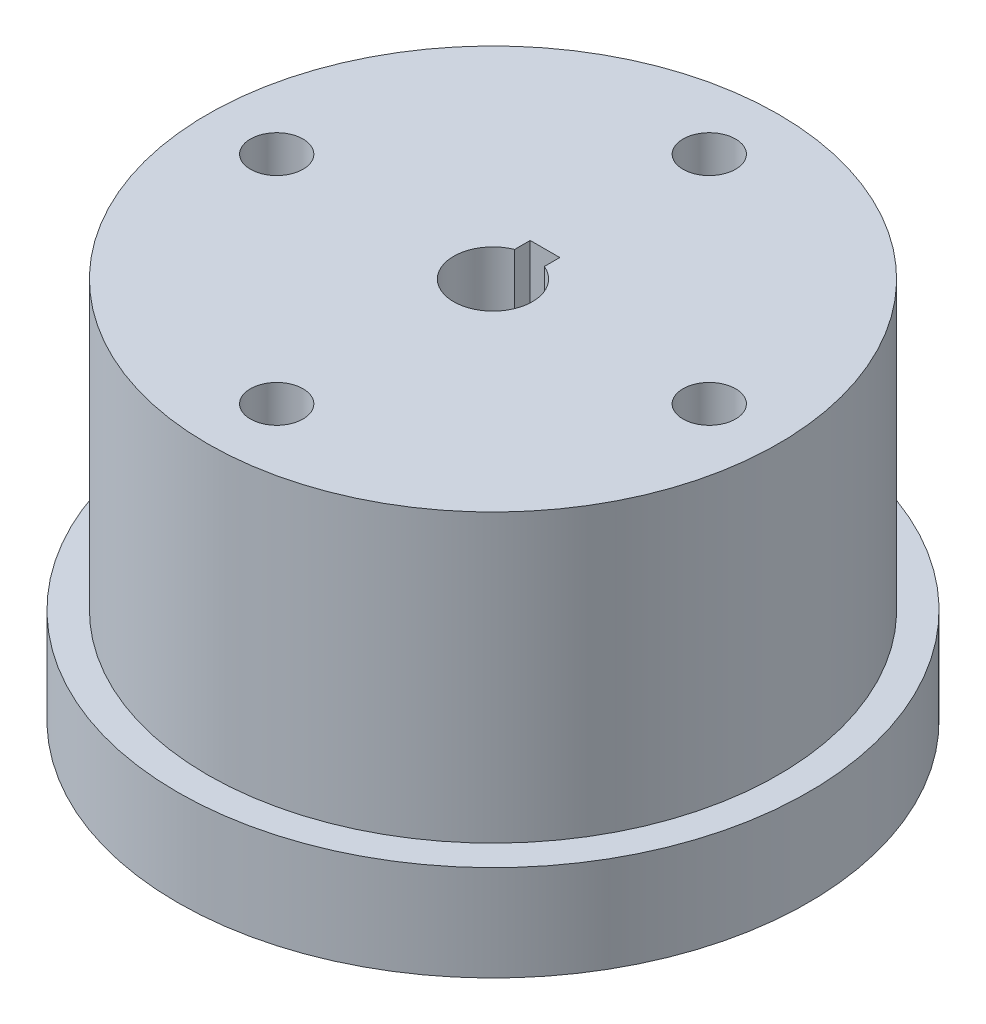
ISO-10303-21;
HEADER;
FILE_DESCRIPTION(('STEP AP214'),'2;1');
FILE_NAME('part.step','',(''),(''),'','','');
FILE_SCHEMA(('AUTOMOTIVE_DESIGN { 1 0 10303 214 1 1 1 1 }'));
ENDSEC;
DATA;
#1=APPLICATION_CONTEXT('core data for automotive mechanical design processes');
#2=APPLICATION_PROTOCOL_DEFINITION('international standard','automotive_design',2000,#1);
#3=PRODUCT_CONTEXT('',#1,'mechanical');
#4=PRODUCT('Part','Part','',(#3));
#5=PRODUCT_RELATED_PRODUCT_CATEGORY('part','',(#4));
#6=PRODUCT_DEFINITION_FORMATION('','',#4);
#7=PRODUCT_DEFINITION_CONTEXT('part definition',#1,'design');
#8=PRODUCT_DEFINITION('design','',#6,#7);
#9=PRODUCT_DEFINITION_SHAPE('','',#8);
#10=(LENGTH_UNIT() NAMED_UNIT(*) SI_UNIT(.MILLI.,.METRE.));
#11=(NAMED_UNIT(*) PLANE_ANGLE_UNIT() SI_UNIT($,.RADIAN.));
#12=(NAMED_UNIT(*) SI_UNIT($,.STERADIAN.) SOLID_ANGLE_UNIT());
#13=UNCERTAINTY_MEASURE_WITH_UNIT(LENGTH_MEASURE(1.E-05),#10,'distance_accuracy_value','');
#14=(GEOMETRIC_REPRESENTATION_CONTEXT(3) GLOBAL_UNCERTAINTY_ASSIGNED_CONTEXT((#13)) GLOBAL_UNIT_ASSIGNED_CONTEXT((#10,
#11,#12)) REPRESENTATION_CONTEXT('',''));
#15=CARTESIAN_POINT('',(0.,0.,0.));
#16=DIRECTION('',(0.,0.,1.));
#17=DIRECTION('',(1.,0.,0.));
#18=AXIS2_PLACEMENT_3D('',#15,#16,#17);
#19=CARTESIAN_POINT('',(0.,0.,0.));
#20=DIRECTION('',(0.,1.,0.));
#21=DIRECTION('',(0.,0.,1.));
#22=AXIS2_PLACEMENT_3D('',#19,#20,#21);
#23=PLANE('',#22);
#24=CARTESIAN_POINT('',(0.,0.,0.));
#25=DIRECTION('',(0.,1.,0.));
#26=DIRECTION('',(0.,0.,1.));
#27=AXIS2_PLACEMENT_3D('',#24,#25,#26);
#28=CIRCLE('',#27,33.);
#29=CARTESIAN_POINT('',(0.,0.,33.));
#30=VERTEX_POINT('',#29);
#31=EDGE_CURVE('E48',#30,#30,#28,.T.);
#32=ORIENTED_EDGE('',*,*,#31,.F.);
#33=EDGE_LOOP('',(#32));
#34=FACE_BOUND('',#33,.T.);
#35=CARTESIAN_POINT('',(-22.6274169979695,0.,0.));
#36=DIRECTION('',(0.,1.,0.));
#37=DIRECTION('',(0.,0.,1.));
#38=AXIS2_PLACEMENT_3D('',#35,#36,#37);
#39=CIRCLE('',#38,2.75);
#40=CARTESIAN_POINT('',(-22.6274169979695,0.,2.75));
#41=VERTEX_POINT('',#40);
#42=EDGE_CURVE('E125',#41,#41,#39,.T.);
#43=ORIENTED_EDGE('',*,*,#42,.T.);
#44=EDGE_LOOP('',(#43));
#45=FACE_BOUND('',#44,.T.);
#46=CARTESIAN_POINT('',(0.,0.,22.6274169979695));
#47=DIRECTION('',(0.,1.,0.));
#48=DIRECTION('',(0.,0.,1.));
#49=AXIS2_PLACEMENT_3D('',#46,#47,#48);
#50=CIRCLE('',#49,2.75);
#51=CARTESIAN_POINT('',(0.,0.,25.3774169979695));
#52=VERTEX_POINT('',#51);
#53=EDGE_CURVE('E136',#52,#52,#50,.T.);
#54=ORIENTED_EDGE('',*,*,#53,.T.);
#55=EDGE_LOOP('',(#54));
#56=FACE_BOUND('',#55,.T.);
#57=CARTESIAN_POINT('',(22.6274169979695,0.,0.));
#58=DIRECTION('',(0.,1.,0.));
#59=DIRECTION('',(0.,0.,1.));
#60=AXIS2_PLACEMENT_3D('',#57,#58,#59);
#61=CIRCLE('',#60,2.75);
#62=CARTESIAN_POINT('',(22.6274169979695,0.,2.74999999999999));
#63=VERTEX_POINT('',#62);
#64=EDGE_CURVE('E139',#63,#63,#61,.T.);
#65=ORIENTED_EDGE('',*,*,#64,.T.);
#66=EDGE_LOOP('',(#65));
#67=FACE_BOUND('',#66,.T.);
#68=CARTESIAN_POINT('',(0.,0.,-22.6274169979695));
#69=DIRECTION('',(0.,1.,0.));
#70=DIRECTION('',(0.,0.,1.));
#71=AXIS2_PLACEMENT_3D('',#68,#69,#70);
#72=CIRCLE('',#71,2.75);
#73=CARTESIAN_POINT('',(0.,0.,-19.8774169979695));
#74=VERTEX_POINT('',#73);
#75=EDGE_CURVE('E142',#74,#74,#72,.T.);
#76=ORIENTED_EDGE('',*,*,#75,.T.);
#77=EDGE_LOOP('',(#76));
#78=FACE_BOUND('',#77,.T.);
#79=DIRECTION('',(1.,0.,0.));
#80=VECTOR('',#79,1.);
#81=CARTESIAN_POINT('',(0.,0.,-5.44));
#82=LINE('',#81,#80);
#83=CARTESIAN_POINT('',(-1.55,0.,-5.44));
#84=VERTEX_POINT('',#83);
#85=CARTESIAN_POINT('',(1.55,0.,-5.44));
#86=VERTEX_POINT('',#85);
#87=EDGE_CURVE('E119',#84,#86,#82,.T.);
#88=ORIENTED_EDGE('',*,*,#87,.F.);
#89=DIRECTION('',(0.,0.,1.));
#90=VECTOR('',#89,1.);
#91=CARTESIAN_POINT('',(-1.55,0.,0.));
#92=LINE('',#91,#90);
#93=CARTESIAN_POINT('',(-1.55,0.,-3.81731581088073));
#94=VERTEX_POINT('',#93);
#95=EDGE_CURVE('E112',#84,#94,#92,.T.);
#96=ORIENTED_EDGE('',*,*,#95,.T.);
#97=CARTESIAN_POINT('',(0.,0.,0.));
#98=DIRECTION('',(0.,1.,0.));
#99=DIRECTION('',(0.,0.,1.));
#100=AXIS2_PLACEMENT_3D('',#97,#98,#99);
#101=CIRCLE('',#100,4.12);
#102=CARTESIAN_POINT('',(1.55,0.,-3.81731581088073));
#103=VERTEX_POINT('',#102);
#104=EDGE_CURVE('E93',#94,#103,#101,.T.);
#105=ORIENTED_EDGE('',*,*,#104,.T.);
#106=DIRECTION('',(0.,0.,1.));
#107=VECTOR('',#106,1.);
#108=CARTESIAN_POINT('',(1.55,0.,0.));
#109=LINE('',#108,#107);
#110=EDGE_CURVE('E117',#86,#103,#109,.T.);
#111=ORIENTED_EDGE('',*,*,#110,.F.);
#112=EDGE_LOOP('',(#88,#96,#105,#111));
#113=FACE_BOUND('',#112,.T.);
#114=ADVANCED_FACE('F44',(#34,#45,#56,#67,#78,#113),#23,.F.);
#115=CARTESIAN_POINT('',(0.,40.,0.));
#116=DIRECTION('',(0.,1.,0.));
#117=DIRECTION('',(0.,0.,1.));
#118=AXIS2_PLACEMENT_3D('',#115,#116,#117);
#119=PLANE('',#118);
#120=CARTESIAN_POINT('',(0.,40.,-22.6274169979695));
#121=DIRECTION('',(0.,1.,0.));
#122=DIRECTION('',(0.,0.,1.));
#123=AXIS2_PLACEMENT_3D('',#120,#121,#122);
#124=CIRCLE('',#123,2.75);
#125=CARTESIAN_POINT('',(0.,40.,-19.8774169979695));
#126=VERTEX_POINT('',#125);
#127=EDGE_CURVE('E122',#126,#126,#124,.T.);
#128=ORIENTED_EDGE('',*,*,#127,.F.);
#129=EDGE_LOOP('',(#128));
#130=FACE_BOUND('',#129,.T.);
#131=CARTESIAN_POINT('',(22.6274169979695,40.,0.));
#132=DIRECTION('',(0.,1.,0.));
#133=DIRECTION('',(0.,0.,1.));
#134=AXIS2_PLACEMENT_3D('',#131,#132,#133);
#135=CIRCLE('',#134,2.75);
#136=CARTESIAN_POINT('',(22.6274169979695,40.,2.74999999999999));
#137=VERTEX_POINT('',#136);
#138=EDGE_CURVE('E126',#137,#137,#135,.T.);
#139=ORIENTED_EDGE('',*,*,#138,.F.);
#140=EDGE_LOOP('',(#139));
#141=FACE_BOUND('',#140,.T.);
#142=CARTESIAN_POINT('',(0.,40.,22.6274169979695));
#143=DIRECTION('',(0.,1.,0.));
#144=DIRECTION('',(0.,0.,1.));
#145=AXIS2_PLACEMENT_3D('',#142,#143,#144);
#146=CIRCLE('',#145,2.75);
#147=CARTESIAN_POINT('',(0.,40.,25.3774169979695));
#148=VERTEX_POINT('',#147);
#149=EDGE_CURVE('E129',#148,#148,#146,.T.);
#150=ORIENTED_EDGE('',*,*,#149,.F.);
#151=EDGE_LOOP('',(#150));
#152=FACE_BOUND('',#151,.T.);
#153=CARTESIAN_POINT('',(-22.6274169979695,40.,0.));
#154=DIRECTION('',(0.,1.,0.));
#155=DIRECTION('',(0.,0.,1.));
#156=AXIS2_PLACEMENT_3D('',#153,#154,#155);
#157=CIRCLE('',#156,2.75);
#158=CARTESIAN_POINT('',(-22.6274169979695,40.,2.75));
#159=VERTEX_POINT('',#158);
#160=EDGE_CURVE('E121',#159,#159,#157,.T.);
#161=ORIENTED_EDGE('',*,*,#160,.F.);
#162=EDGE_LOOP('',(#161));
#163=FACE_BOUND('',#162,.T.);
#164=CARTESIAN_POINT('',(0.,40.,0.));
#165=DIRECTION('',(0.,1.,0.));
#166=DIRECTION('',(0.,0.,1.));
#167=AXIS2_PLACEMENT_3D('',#164,#165,#166);
#168=CIRCLE('',#167,29.86);
#169=CARTESIAN_POINT('',(0.,40.,29.86));
#170=VERTEX_POINT('',#169);
#171=EDGE_CURVE('E145',#170,#170,#168,.T.);
#172=ORIENTED_EDGE('',*,*,#171,.T.);
#173=EDGE_LOOP('',(#172));
#174=FACE_BOUND('',#173,.T.);
#175=DIRECTION('',(0.,0.,1.));
#176=VECTOR('',#175,1.);
#177=CARTESIAN_POINT('',(-1.55,40.,0.));
#178=LINE('',#177,#176);
#179=CARTESIAN_POINT('',(-1.55,40.,-5.44));
#180=VERTEX_POINT('',#179);
#181=CARTESIAN_POINT('',(-1.55,40.,-3.81731581088073));
#182=VERTEX_POINT('',#181);
#183=EDGE_CURVE('E99',#180,#182,#178,.T.);
#184=ORIENTED_EDGE('',*,*,#183,.F.);
#185=DIRECTION('',(1.,0.,0.));
#186=VECTOR('',#185,1.);
#187=CARTESIAN_POINT('',(0.,40.,-5.44));
#188=LINE('',#187,#186);
#189=CARTESIAN_POINT('',(1.55,40.,-5.44));
#190=VERTEX_POINT('',#189);
#191=EDGE_CURVE('E69',#180,#190,#188,.T.);
#192=ORIENTED_EDGE('',*,*,#191,.T.);
#193=DIRECTION('',(0.,0.,1.));
#194=VECTOR('',#193,1.);
#195=CARTESIAN_POINT('',(1.55,40.,0.));
#196=LINE('',#195,#194);
#197=CARTESIAN_POINT('',(1.55,40.,-3.81731581088073));
#198=VERTEX_POINT('',#197);
#199=EDGE_CURVE('E105',#190,#198,#196,.T.);
#200=ORIENTED_EDGE('',*,*,#199,.T.);
#201=CARTESIAN_POINT('',(0.,40.,0.));
#202=DIRECTION('',(0.,1.,0.));
#203=DIRECTION('',(0.,0.,1.));
#204=AXIS2_PLACEMENT_3D('',#201,#202,#203);
#205=CIRCLE('',#204,4.12);
#206=EDGE_CURVE('E90',#182,#198,#205,.T.);
#207=ORIENTED_EDGE('',*,*,#206,.F.);
#208=EDGE_LOOP('',(#184,#192,#200,#207));
#209=FACE_BOUND('',#208,.T.);
#210=ADVANCED_FACE('F103',(#130,#141,#152,#163,#174,#209),#119,.T.);
#211=CARTESIAN_POINT('',(0.,10.,0.));
#212=DIRECTION('',(0.,-1.,0.));
#213=DIRECTION('',(0.,0.,-1.));
#214=AXIS2_PLACEMENT_3D('',#211,#212,#213);
#215=CYLINDRICAL_SURFACE('',#214,33.);
#216=CARTESIAN_POINT('',(0.,10.,0.));
#217=DIRECTION('',(0.,1.,0.));
#218=DIRECTION('',(0.,0.,1.));
#219=AXIS2_PLACEMENT_3D('',#216,#217,#218);
#220=CIRCLE('',#219,33.);
#221=CARTESIAN_POINT('',(0.,10.,33.));
#222=VERTEX_POINT('',#221);
#223=EDGE_CURVE('E53',#222,#222,#220,.T.);
#224=ORIENTED_EDGE('',*,*,#223,.F.);
#225=EDGE_LOOP('',(#224));
#226=FACE_BOUND('',#225,.T.);
#227=ORIENTED_EDGE('',*,*,#31,.T.);
#228=EDGE_LOOP('',(#227));
#229=FACE_BOUND('',#228,.T.);
#230=ADVANCED_FACE('F46',(#226,#229),#215,.T.);
#231=CARTESIAN_POINT('',(0.,10.,0.));
#232=DIRECTION('',(0.,1.,0.));
#233=DIRECTION('',(0.,0.,1.));
#234=AXIS2_PLACEMENT_3D('',#231,#232,#233);
#235=PLANE('',#234);
#236=CARTESIAN_POINT('',(0.,10.,0.));
#237=DIRECTION('',(0.,1.,0.));
#238=DIRECTION('',(0.,0.,1.));
#239=AXIS2_PLACEMENT_3D('',#236,#237,#238);
#240=CIRCLE('',#239,29.86);
#241=CARTESIAN_POINT('',(0.,10.,29.86));
#242=VERTEX_POINT('',#241);
#243=EDGE_CURVE('E11',#242,#242,#240,.T.);
#244=ORIENTED_EDGE('',*,*,#243,.F.);
#245=EDGE_LOOP('',(#244));
#246=FACE_BOUND('',#245,.T.);
#247=ORIENTED_EDGE('',*,*,#223,.T.);
#248=EDGE_LOOP('',(#247));
#249=FACE_BOUND('',#248,.T.);
#250=ADVANCED_FACE('F203',(#246,#249),#235,.T.);
#251=CARTESIAN_POINT('',(0.,40.,0.));
#252=DIRECTION('',(0.,-1.,0.));
#253=DIRECTION('',(0.,0.,-1.));
#254=AXIS2_PLACEMENT_3D('',#251,#252,#253);
#255=CYLINDRICAL_SURFACE('',#254,29.86);
#256=ORIENTED_EDGE('',*,*,#171,.F.);
#257=EDGE_LOOP('',(#256));
#258=FACE_BOUND('',#257,.T.);
#259=ORIENTED_EDGE('',*,*,#243,.T.);
#260=EDGE_LOOP('',(#259));
#261=FACE_BOUND('',#260,.T.);
#262=ADVANCED_FACE('F196',(#258,#261),#255,.T.);
#263=CARTESIAN_POINT('',(-22.6274169979695,-14.,0.));
#264=DIRECTION('',(0.,1.,0.));
#265=DIRECTION('',(0.,0.,1.));
#266=AXIS2_PLACEMENT_3D('',#263,#264,#265);
#267=CYLINDRICAL_SURFACE('',#266,2.75);
#268=ORIENTED_EDGE('',*,*,#160,.T.);
#269=EDGE_LOOP('',(#268));
#270=FACE_BOUND('',#269,.T.);
#271=ORIENTED_EDGE('',*,*,#42,.F.);
#272=EDGE_LOOP('',(#271));
#273=FACE_BOUND('',#272,.T.);
#274=ADVANCED_FACE('F192',(#270,#273),#267,.F.);
#275=CARTESIAN_POINT('',(0.,-14.,22.6274169979695));
#276=DIRECTION('',(0.,1.,0.));
#277=DIRECTION('',(0.,0.,1.));
#278=AXIS2_PLACEMENT_3D('',#275,#276,#277);
#279=CYLINDRICAL_SURFACE('',#278,2.75);
#280=ORIENTED_EDGE('',*,*,#149,.T.);
#281=EDGE_LOOP('',(#280));
#282=FACE_BOUND('',#281,.T.);
#283=ORIENTED_EDGE('',*,*,#53,.F.);
#284=EDGE_LOOP('',(#283));
#285=FACE_BOUND('',#284,.T.);
#286=ADVANCED_FACE('F188',(#282,#285),#279,.F.);
#287=CARTESIAN_POINT('',(22.6274169979695,-14.,0.));
#288=DIRECTION('',(0.,1.,0.));
#289=DIRECTION('',(0.,0.,1.));
#290=AXIS2_PLACEMENT_3D('',#287,#288,#289);
#291=CYLINDRICAL_SURFACE('',#290,2.75);
#292=ORIENTED_EDGE('',*,*,#138,.T.);
#293=EDGE_LOOP('',(#292));
#294=FACE_BOUND('',#293,.T.);
#295=ORIENTED_EDGE('',*,*,#64,.F.);
#296=EDGE_LOOP('',(#295));
#297=FACE_BOUND('',#296,.T.);
#298=ADVANCED_FACE('F184',(#294,#297),#291,.F.);
#299=CARTESIAN_POINT('',(0.,-14.,-22.6274169979695));
#300=DIRECTION('',(0.,1.,0.));
#301=DIRECTION('',(0.,0.,1.));
#302=AXIS2_PLACEMENT_3D('',#299,#300,#301);
#303=CYLINDRICAL_SURFACE('',#302,2.75);
#304=ORIENTED_EDGE('',*,*,#127,.T.);
#305=EDGE_LOOP('',(#304));
#306=FACE_BOUND('',#305,.T.);
#307=ORIENTED_EDGE('',*,*,#75,.F.);
#308=EDGE_LOOP('',(#307));
#309=FACE_BOUND('',#308,.T.);
#310=ADVANCED_FACE('F177',(#306,#309),#303,.F.);
#311=CARTESIAN_POINT('',(0.,-14.,-5.44));
#312=DIRECTION('',(0.,0.,1.));
#313=DIRECTION('',(1.,0.,0.));
#314=AXIS2_PLACEMENT_3D('',#311,#312,#313);
#315=PLANE('',#314);
#316=ORIENTED_EDGE('',*,*,#87,.T.);
#317=DIRECTION('',(0.,1.,0.));
#318=VECTOR('',#317,1.);
#319=CARTESIAN_POINT('',(1.55,-14.,-5.44));
#320=LINE('',#319,#318);
#321=EDGE_CURVE('E110',#86,#190,#320,.T.);
#322=ORIENTED_EDGE('',*,*,#321,.T.);
#323=ORIENTED_EDGE('',*,*,#191,.F.);
#324=DIRECTION('',(0.,1.,0.));
#325=VECTOR('',#324,1.);
#326=CARTESIAN_POINT('',(-1.55,-14.,-5.44));
#327=LINE('',#326,#325);
#328=EDGE_CURVE('E96',#84,#180,#327,.T.);
#329=ORIENTED_EDGE('',*,*,#328,.F.);
#330=EDGE_LOOP('',(#316,#322,#323,#329));
#331=FACE_BOUND('',#330,.T.);
#332=ADVANCED_FACE('F167',(#331),#315,.T.);
#333=CARTESIAN_POINT('',(1.55,-14.,0.));
#334=DIRECTION('',(-1.,0.,0.));
#335=DIRECTION('',(0.,0.,1.));
#336=AXIS2_PLACEMENT_3D('',#333,#334,#335);
#337=PLANE('',#336);
#338=ORIENTED_EDGE('',*,*,#110,.T.);
#339=DIRECTION('',(0.,1.,0.));
#340=VECTOR('',#339,1.);
#341=CARTESIAN_POINT('',(1.55,-14.,-3.81731581088073));
#342=LINE('',#341,#340);
#343=EDGE_CURVE('E95',#103,#198,#342,.T.);
#344=ORIENTED_EDGE('',*,*,#343,.T.);
#345=ORIENTED_EDGE('',*,*,#199,.F.);
#346=ORIENTED_EDGE('',*,*,#321,.F.);
#347=EDGE_LOOP('',(#338,#344,#345,#346));
#348=FACE_BOUND('',#347,.T.);
#349=ADVANCED_FACE('F169',(#348),#337,.T.);
#350=CARTESIAN_POINT('',(0.,-14.,0.));
#351=DIRECTION('',(0.,1.,0.));
#352=DIRECTION('',(0.,0.,1.));
#353=AXIS2_PLACEMENT_3D('',#350,#351,#352);
#354=CYLINDRICAL_SURFACE('',#353,4.12);
#355=DIRECTION('',(0.,1.,0.));
#356=VECTOR('',#355,1.);
#357=CARTESIAN_POINT('',(-1.55,-14.,-3.81731581088073));
#358=LINE('',#357,#356);
#359=EDGE_CURVE('E61',#94,#182,#358,.T.);
#360=ORIENTED_EDGE('',*,*,#359,.T.);
#361=ORIENTED_EDGE('',*,*,#206,.T.);
#362=ORIENTED_EDGE('',*,*,#343,.F.);
#363=ORIENTED_EDGE('',*,*,#104,.F.);
#364=EDGE_LOOP('',(#360,#361,#362,#363));
#365=FACE_BOUND('',#364,.T.);
#366=ADVANCED_FACE('F87',(#365),#354,.F.);
#367=CARTESIAN_POINT('',(-1.55,-14.,0.));
#368=DIRECTION('',(-1.,0.,0.));
#369=DIRECTION('',(0.,0.,1.));
#370=AXIS2_PLACEMENT_3D('',#367,#368,#369);
#371=PLANE('',#370);
#372=ORIENTED_EDGE('',*,*,#328,.T.);
#373=ORIENTED_EDGE('',*,*,#183,.T.);
#374=ORIENTED_EDGE('',*,*,#359,.F.);
#375=ORIENTED_EDGE('',*,*,#95,.F.);
#376=EDGE_LOOP('',(#372,#373,#374,#375));
#377=FACE_BOUND('',#376,.T.);
#378=ADVANCED_FACE('F100',(#377),#371,.F.);
#379=CLOSED_SHELL('',(#114,#210,#230,#250,#262,#274,#286,#298,#310,#332,#349,#366,#378));
#380=MANIFOLD_SOLID_BREP('B2',#379);
#381=ADVANCED_BREP_SHAPE_REPRESENTATION('',(#18,#380),#14);
#382=SHAPE_DEFINITION_REPRESENTATION(#9,#381);
ENDSEC;
END-ISO-10303-21;
